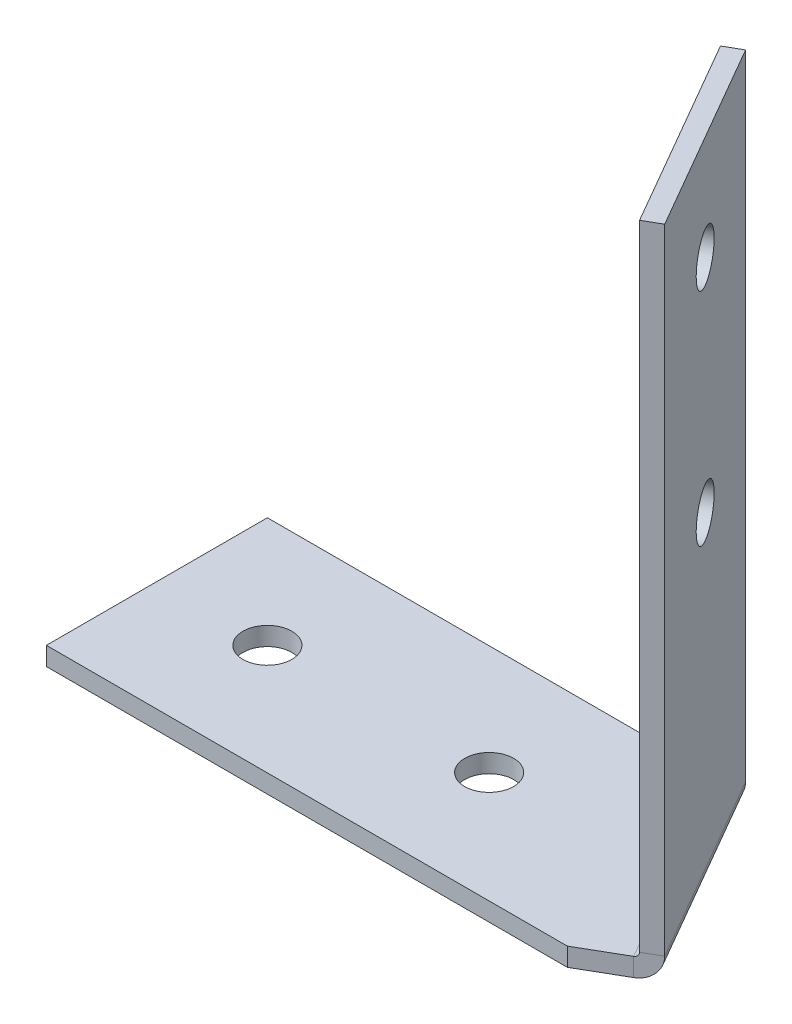
ISO-10303-21;
HEADER;
FILE_DESCRIPTION(('STEP AP214'),'2;1');
FILE_NAME('part.step','',(''),(''),'','','');
FILE_SCHEMA(('AUTOMOTIVE_DESIGN { 1 0 10303 214 1 1 1 1 }'));
ENDSEC;
DATA;
#1=APPLICATION_CONTEXT('core data for automotive mechanical design processes');
#2=APPLICATION_PROTOCOL_DEFINITION('international standard','automotive_design',2000,#1);
#3=PRODUCT_CONTEXT('',#1,'mechanical');
#4=PRODUCT('Part','Part','',(#3));
#5=PRODUCT_RELATED_PRODUCT_CATEGORY('part','',(#4));
#6=PRODUCT_DEFINITION_FORMATION('','',#4);
#7=PRODUCT_DEFINITION_CONTEXT('part definition',#1,'design');
#8=PRODUCT_DEFINITION('design','',#6,#7);
#9=PRODUCT_DEFINITION_SHAPE('','',#8);
#10=(LENGTH_UNIT() NAMED_UNIT(*) SI_UNIT(.MILLI.,.METRE.));
#11=(NAMED_UNIT(*) PLANE_ANGLE_UNIT() SI_UNIT($,.RADIAN.));
#12=(NAMED_UNIT(*) SI_UNIT($,.STERADIAN.) SOLID_ANGLE_UNIT());
#13=UNCERTAINTY_MEASURE_WITH_UNIT(LENGTH_MEASURE(1.E-05),#10,'distance_accuracy_value','');
#14=(GEOMETRIC_REPRESENTATION_CONTEXT(3) GLOBAL_UNCERTAINTY_ASSIGNED_CONTEXT((#13)) GLOBAL_UNIT_ASSIGNED_CONTEXT((#10,
#11,#12)) REPRESENTATION_CONTEXT('',''));
#15=CARTESIAN_POINT('',(0.,0.,0.));
#16=DIRECTION('',(0.,0.,1.));
#17=DIRECTION('',(1.,0.,0.));
#18=AXIS2_PLACEMENT_3D('',#15,#16,#17);
#19=CARTESIAN_POINT('',(78.0067508060374,-89.0769248960511,-45.0372185764735));
#20=DIRECTION('',(-0.86602540378444,0.,0.499999999999998));
#21=DIRECTION('',(0.43301270189222,-0.499999999999998,0.750000000000001));
#22=AXIS2_PLACEMENT_3D('',#19,#20,#21);
#23=PLANE('',#22);
#24=CARTESIAN_POINT('',(90.9347055499118,92.0750000000004,-22.6453441221305));
#25=DIRECTION('',(-0.86602540378444,0.,0.499999999999998));
#26=DIRECTION('',(0.499999999999998,0.,0.86602540378444));
#27=AXIS2_PLACEMENT_3D('',#24,#25,#26);
#28=CIRCLE('',#27,4.21639999999999);
#29=CARTESIAN_POINT('',(93.0429055499118,92.0750000000004,-18.9938346096138));
#30=VERTEX_POINT('',#29);
#31=EDGE_CURVE('E433',#30,#30,#28,.T.);
#32=ORIENTED_EDGE('',*,*,#31,.T.);
#33=EDGE_LOOP('',(#32));
#34=FACE_BOUND('',#33,.T.);
#35=CARTESIAN_POINT('',(90.934705549912,53.9750000000004,-22.6453441221305));
#36=DIRECTION('',(-0.86602540378444,0.,0.499999999999998));
#37=DIRECTION('',(0.499999999999998,0.,0.86602540378444));
#38=AXIS2_PLACEMENT_3D('',#35,#36,#37);
#39=CIRCLE('',#38,4.21639999999999);
#40=CARTESIAN_POINT('',(93.042905549912,53.9750000000004,-18.9938346096138));
#41=VERTEX_POINT('',#40);
#42=EDGE_CURVE('E429',#41,#41,#39,.T.);
#43=ORIENTED_EDGE('',*,*,#42,.T.);
#44=EDGE_LOOP('',(#43));
#45=FACE_BOUND('',#44,.T.);
#46=DIRECTION('',(0.,1.,0.));
#47=VECTOR('',#46,1.);
#48=CARTESIAN_POINT('',(100.459705549912,-11.2976081031777,-6.14756018003684));
#49=LINE('',#48,#47);
#50=CARTESIAN_POINT('',(100.459705549912,0.736600000000018,-6.14756018003682));
#51=VERTEX_POINT('',#50);
#52=CARTESIAN_POINT('',(100.459705549912,110.036256128448,-6.14756018003666));
#53=VERTEX_POINT('',#52);
#54=EDGE_CURVE('E59',#51,#53,#49,.T.);
#55=ORIENTED_EDGE('',*,*,#54,.F.);
#56=DIRECTION('',(-0.499999999999998,0.,-0.86602540378444));
#57=VECTOR('',#56,1.);
#58=CARTESIAN_POINT('',(78.0067508060371,0.73659999999999,-45.0372185764734));
#59=LINE('',#58,#57);
#60=CARTESIAN_POINT('',(81.4097055499123,0.736600000000027,-39.143128064224));
#61=VERTEX_POINT('',#60);
#62=EDGE_CURVE('E161',#51,#61,#59,.T.);
#63=ORIENTED_EDGE('',*,*,#62,.T.);
#64=DIRECTION('',(0.,-1.,0.));
#65=VECTOR('',#64,1.);
#66=CARTESIAN_POINT('',(81.4097055499119,110.036256128448,-39.1431280642239));
#67=LINE('',#66,#65);
#68=CARTESIAN_POINT('',(81.4097055499119,110.036256128448,-39.1431280642239));
#69=VERTEX_POINT('',#68);
#70=EDGE_CURVE('E378',#69,#61,#67,.T.);
#71=ORIENTED_EDGE('',*,*,#70,.F.);
#72=DIRECTION('',(-0.499999999999998,0.,-0.86602540378444));
#73=VECTOR('',#72,1.);
#74=CARTESIAN_POINT('',(100.459705549912,110.036256128448,-6.14756018003666));
#75=LINE('',#74,#73);
#76=EDGE_CURVE('E375',#53,#69,#75,.T.);
#77=ORIENTED_EDGE('',*,*,#76,.F.);
#78=EDGE_LOOP('',(#55,#63,#71,#77));
#79=FACE_BOUND('',#78,.T.);
#80=ADVANCED_FACE('F55',(#34,#45,#79),#23,.F.);
#81=CARTESIAN_POINT('',(81.4097055499119,110.036256128448,-39.1431280642239));
#82=DIRECTION('',(-0.499999999999998,0.,-0.86602540378444));
#83=DIRECTION('',(0.,-1.,0.));
#84=AXIS2_PLACEMENT_3D('',#81,#82,#83);
#85=PLANE('',#84);
#86=DIRECTION('',(0.86602540378444,0.,-0.499999999999998));
#87=VECTOR('',#86,1.);
#88=CARTESIAN_POINT('',(81.4097055499123,0.73659999999999,-39.143128064224));
#89=LINE('',#88,#87);
#90=CARTESIAN_POINT('',(78.6600748928967,0.736600000000004,-37.555628064224));
#91=VERTEX_POINT('',#90);
#92=EDGE_CURVE('E12',#91,#61,#89,.T.);
#93=ORIENTED_EDGE('',*,*,#92,.F.);
#94=DIRECTION('',(0.,-1.,0.));
#95=VECTOR('',#94,1.);
#96=CARTESIAN_POINT('',(78.6600748928963,110.036256128448,-37.5556280642239));
#97=LINE('',#96,#95);
#98=CARTESIAN_POINT('',(78.6600748928963,110.036256128448,-37.5556280642239));
#99=VERTEX_POINT('',#98);
#100=EDGE_CURVE('E72',#99,#91,#97,.T.);
#101=ORIENTED_EDGE('',*,*,#100,.F.);
#102=DIRECTION('',(-0.86602540378444,0.,0.499999999999998));
#103=VECTOR('',#102,1.);
#104=CARTESIAN_POINT('',(81.4097055499119,110.036256128448,-39.1431280642239));
#105=LINE('',#104,#103);
#106=EDGE_CURVE('E381',#69,#99,#105,.T.);
#107=ORIENTED_EDGE('',*,*,#106,.F.);
#108=ORIENTED_EDGE('',*,*,#70,.T.);
#109=EDGE_LOOP('',(#93,#101,#107,#108));
#110=FACE_BOUND('',#109,.T.);
#111=ADVANCED_FACE('F57',(#110),#85,.T.);
#112=CARTESIAN_POINT('',(100.459705549912,110.036256128448,-6.14756018003666));
#113=DIRECTION('',(0.,1.,0.));
#114=DIRECTION('',(-0.499999999999998,0.,-0.86602540378444));
#115=AXIS2_PLACEMENT_3D('',#112,#113,#114);
#116=PLANE('',#115);
#117=DIRECTION('',(-0.499999999999998,0.,-0.86602540378444));
#118=VECTOR('',#117,1.);
#119=CARTESIAN_POINT('',(97.7100748928963,110.036256128448,-4.56006018003667));
#120=LINE('',#119,#118);
#121=CARTESIAN_POINT('',(97.7100748928963,110.036256128448,-4.56006018003667));
#122=VERTEX_POINT('',#121);
#123=EDGE_CURVE('E379',#122,#99,#120,.T.);
#124=ORIENTED_EDGE('',*,*,#123,.F.);
#125=DIRECTION('',(-0.86602540378444,0.,0.499999999999998));
#126=VECTOR('',#125,1.);
#127=CARTESIAN_POINT('',(100.459705549912,110.036256128448,-6.14756018003666));
#128=LINE('',#127,#126);
#129=EDGE_CURVE('E383',#53,#122,#128,.T.);
#130=ORIENTED_EDGE('',*,*,#129,.F.);
#131=ORIENTED_EDGE('',*,*,#76,.T.);
#132=ORIENTED_EDGE('',*,*,#106,.T.);
#133=EDGE_LOOP('',(#124,#130,#131,#132));
#134=FACE_BOUND('',#133,.T.);
#135=ADVANCED_FACE('F219',(#134),#116,.T.);
#136=CARTESIAN_POINT('',(100.459705549912,-11.2976081031777,-6.14756018003684));
#137=DIRECTION('',(0.499999999999998,0.,0.86602540378444));
#138=DIRECTION('',(0.,1.,0.));
#139=AXIS2_PLACEMENT_3D('',#136,#137,#138);
#140=PLANE('',#139);
#141=DIRECTION('',(-0.86602540378444,0.,0.499999999999998));
#142=VECTOR('',#141,1.);
#143=CARTESIAN_POINT('',(100.459705549912,0.736600000000018,-6.14756018003682));
#144=LINE('',#143,#142);
#145=CARTESIAN_POINT('',(97.7100748928966,0.736600000000004,-4.56006018003682));
#146=VERTEX_POINT('',#145);
#147=EDGE_CURVE('E248',#51,#146,#144,.T.);
#148=ORIENTED_EDGE('',*,*,#147,.F.);
#149=ORIENTED_EDGE('',*,*,#54,.T.);
#150=ORIENTED_EDGE('',*,*,#129,.T.);
#151=DIRECTION('',(0.,1.,0.));
#152=VECTOR('',#151,1.);
#153=CARTESIAN_POINT('',(97.7100748928967,-11.2976081031777,-4.56006018003684));
#154=LINE('',#153,#152);
#155=EDGE_CURVE('E80',#146,#122,#154,.T.);
#156=ORIENTED_EDGE('',*,*,#155,.F.);
#157=EDGE_LOOP('',(#148,#149,#150,#156));
#158=FACE_BOUND('',#157,.T.);
#159=ADVANCED_FACE('F222',(#158),#140,.T.);
#160=CARTESIAN_POINT('',(75.2571201490218,-89.0769248960511,-43.4497185764735));
#161=DIRECTION('',(-0.86602540378444,0.,0.499999999999998));
#162=DIRECTION('',(0.43301270189222,-0.499999999999998,0.750000000000001));
#163=AXIS2_PLACEMENT_3D('',#160,#161,#162);
#164=PLANE('',#163);
#165=CARTESIAN_POINT('',(88.1850748928963,92.0750000000004,-21.0578441221305));
#166=DIRECTION('',(-0.866025403784439,0.,0.499999999999998));
#167=DIRECTION('',(0.499999999999999,0.,0.86602540378444));
#168=AXIS2_PLACEMENT_3D('',#165,#166,#167);
#169=CIRCLE('',#168,4.21639999999999);
#170=CARTESIAN_POINT('',(90.2932748928963,92.0750000000004,-17.4063346096138));
#171=VERTEX_POINT('',#170);
#172=EDGE_CURVE('E241',#171,#171,#169,.T.);
#173=ORIENTED_EDGE('',*,*,#172,.F.);
#174=EDGE_LOOP('',(#173));
#175=FACE_BOUND('',#174,.T.);
#176=CARTESIAN_POINT('',(88.1850748928965,53.9750000000004,-21.0578441221305));
#177=DIRECTION('',(-0.866025403784439,0.,0.499999999999998));
#178=DIRECTION('',(0.499999999999999,0.,0.86602540378444));
#179=AXIS2_PLACEMENT_3D('',#176,#177,#178);
#180=CIRCLE('',#179,4.21639999999999);
#181=CARTESIAN_POINT('',(90.2932748928964,53.9750000000004,-17.4063346096138));
#182=VERTEX_POINT('',#181);
#183=EDGE_CURVE('E244',#182,#182,#180,.T.);
#184=ORIENTED_EDGE('',*,*,#183,.F.);
#185=EDGE_LOOP('',(#184));
#186=FACE_BOUND('',#185,.T.);
#187=DIRECTION('',(-0.499999999999998,0.,-0.86602540378444));
#188=VECTOR('',#187,1.);
#189=CARTESIAN_POINT('',(75.2571201490215,0.736599999999976,-43.4497185764734));
#190=LINE('',#189,#188);
#191=EDGE_CURVE('E64',#146,#91,#190,.T.);
#192=ORIENTED_EDGE('',*,*,#191,.F.);
#193=ORIENTED_EDGE('',*,*,#155,.T.);
#194=ORIENTED_EDGE('',*,*,#123,.T.);
#195=ORIENTED_EDGE('',*,*,#100,.T.);
#196=EDGE_LOOP('',(#192,#193,#194,#195));
#197=FACE_BOUND('',#196,.T.);
#198=ADVANCED_FACE('F228',(#175,#186,#197),#164,.T.);
#199=CARTESIAN_POINT('',(0.,-3.175,0.));
#200=DIRECTION('',(-1.,0.,0.));
#201=DIRECTION('',(0.,0.,1.));
#202=AXIS2_PLACEMENT_3D('',#199,#200,#201);
#203=PLANE('',#202);
#204=DIRECTION('',(0.,0.,1.));
#205=VECTOR('',#204,1.);
#206=CARTESIAN_POINT('',(0.,0.,0.));
#207=LINE('',#206,#205);
#208=CARTESIAN_POINT('',(0.,0.,-38.1));
#209=VERTEX_POINT('',#208);
#210=CARTESIAN_POINT('',(0.,0.,0.));
#211=VERTEX_POINT('',#210);
#212=EDGE_CURVE('E365',#209,#211,#207,.T.);
#213=ORIENTED_EDGE('',*,*,#212,.F.);
#214=DIRECTION('',(0.,1.,0.));
#215=VECTOR('',#214,1.);
#216=CARTESIAN_POINT('',(0.,-3.175,-38.1));
#217=LINE('',#216,#215);
#218=CARTESIAN_POINT('',(0.,-3.175,-38.1));
#219=VERTEX_POINT('',#218);
#220=EDGE_CURVE('E194',#219,#209,#217,.T.);
#221=ORIENTED_EDGE('',*,*,#220,.F.);
#222=DIRECTION('',(0.,0.,1.));
#223=VECTOR('',#222,1.);
#224=CARTESIAN_POINT('',(0.,-3.175,0.));
#225=LINE('',#224,#223);
#226=CARTESIAN_POINT('',(0.,-3.175,0.));
#227=VERTEX_POINT('',#226);
#228=EDGE_CURVE('E175',#219,#227,#225,.T.);
#229=ORIENTED_EDGE('',*,*,#228,.T.);
#230=DIRECTION('',(0.,1.,0.));
#231=VECTOR('',#230,1.);
#232=CARTESIAN_POINT('',(0.,-3.175,0.));
#233=LINE('',#232,#231);
#234=EDGE_CURVE('E186',#227,#211,#233,.T.);
#235=ORIENTED_EDGE('',*,*,#234,.T.);
#236=EDGE_LOOP('',(#213,#221,#229,#235));
#237=FACE_BOUND('',#236,.T.);
#238=ADVANCED_FACE('F230',(#237),#203,.T.);
#239=CARTESIAN_POINT('',(0.,-3.175,0.));
#240=DIRECTION('',(0.,0.,1.));
#241=DIRECTION('',(1.,0.,0.));
#242=AXIS2_PLACEMENT_3D('',#239,#240,#241);
#243=PLANE('',#242);
#244=DIRECTION('',(1.,0.,0.));
#245=VECTOR('',#244,1.);
#246=CARTESIAN_POINT('',(0.,0.,0.));
#247=LINE('',#246,#245);
#248=CARTESIAN_POINT('',(89.8118189755011,0.,0.));
#249=VERTEX_POINT('',#248);
#250=EDGE_CURVE('E362',#211,#249,#247,.T.);
#251=ORIENTED_EDGE('',*,*,#250,.F.);
#252=ORIENTED_EDGE('',*,*,#234,.F.);
#253=DIRECTION('',(1.,0.,0.));
#254=VECTOR('',#253,1.);
#255=CARTESIAN_POINT('',(0.,-3.175,0.));
#256=LINE('',#255,#254);
#257=CARTESIAN_POINT('',(89.8118189755011,-3.175,0.));
#258=VERTEX_POINT('',#257);
#259=EDGE_CURVE('E181',#227,#258,#256,.T.);
#260=ORIENTED_EDGE('',*,*,#259,.T.);
#261=DIRECTION('',(0.,1.,0.));
#262=VECTOR('',#261,1.);
#263=CARTESIAN_POINT('',(89.8118189755011,-3.175,0.));
#264=LINE('',#263,#262);
#265=EDGE_CURVE('E179',#258,#249,#264,.T.);
#266=ORIENTED_EDGE('',*,*,#265,.T.);
#267=EDGE_LOOP('',(#251,#252,#260,#266));
#268=FACE_BOUND('',#267,.T.);
#269=ADVANCED_FACE('F235',(#268),#243,.T.);
#270=CARTESIAN_POINT('',(0.,-3.175,0.));
#271=DIRECTION('',(0.,1.,0.));
#272=DIRECTION('',(0.,0.,1.));
#273=AXIS2_PLACEMENT_3D('',#270,#271,#272);
#274=PLANE('',#273);
#275=CARTESIAN_POINT('',(19.05,-3.175,-19.05));
#276=DIRECTION('',(0.,1.,0.));
#277=DIRECTION('',(0.,0.,1.));
#278=AXIS2_PLACEMENT_3D('',#275,#276,#277);
#279=CIRCLE('',#278,4.2164);
#280=CARTESIAN_POINT('',(19.05,-3.175,-14.8336));
#281=VERTEX_POINT('',#280);
#282=EDGE_CURVE('E423',#281,#281,#279,.T.);
#283=ORIENTED_EDGE('',*,*,#282,.T.);
#284=EDGE_LOOP('',(#283));
#285=FACE_BOUND('',#284,.T.);
#286=CARTESIAN_POINT('',(57.15,-3.175,-19.1887568699662));
#287=DIRECTION('',(0.,1.,0.));
#288=DIRECTION('',(0.,0.,1.));
#289=AXIS2_PLACEMENT_3D('',#286,#287,#288);
#290=CIRCLE('',#289,4.2164);
#291=CARTESIAN_POINT('',(57.15,-3.175,-14.9723568699662));
#292=VERTEX_POINT('',#291);
#293=EDGE_CURVE('E257',#292,#292,#290,.T.);
#294=ORIENTED_EDGE('',*,*,#293,.T.);
#295=EDGE_LOOP('',(#294));
#296=FACE_BOUND('',#295,.T.);
#297=DIRECTION('',(-0.499999999999998,0.,-0.86602540378444));
#298=VECTOR('',#297,1.);
#299=CARTESIAN_POINT('',(74.6192058365939,-3.175,-43.0814185764733));
#300=LINE('',#299,#298);
#301=CARTESIAN_POINT('',(97.072160580469,-3.175,-4.19176018003681));
#302=VERTEX_POINT('',#301);
#303=CARTESIAN_POINT('',(77.495229192667,-3.175,-38.1));
#304=VERTEX_POINT('',#303);
#305=EDGE_CURVE('E158',#302,#304,#300,.T.);
#306=ORIENTED_EDGE('',*,*,#305,.F.);
#307=DIRECTION('',(0.86602540378444,0.,-0.499999999999998));
#308=VECTOR('',#307,1.);
#309=CARTESIAN_POINT('',(89.8118189755011,-3.175,0.));
#310=LINE('',#309,#308);
#311=EDGE_CURVE('E151',#258,#302,#310,.T.);
#312=ORIENTED_EDGE('',*,*,#311,.F.);
#313=ORIENTED_EDGE('',*,*,#259,.F.);
#314=ORIENTED_EDGE('',*,*,#228,.F.);
#315=DIRECTION('',(-1.,0.,0.));
#316=VECTOR('',#315,1.);
#317=CARTESIAN_POINT('',(79.6029547438754,-3.175,-38.1));
#318=LINE('',#317,#316);
#319=EDGE_CURVE('E172',#304,#219,#318,.T.);
#320=ORIENTED_EDGE('',*,*,#319,.F.);
#321=EDGE_LOOP('',(#306,#312,#313,#314,#320));
#322=FACE_BOUND('',#321,.T.);
#323=ADVANCED_FACE('F168',(#285,#296,#322),#274,.F.);
#324=CARTESIAN_POINT('',(89.8118189755011,-3.175,0.));
#325=DIRECTION('',(0.499999999999998,0.,0.86602540378444));
#326=DIRECTION('',(0.86602540378444,0.,-0.499999999999998));
#327=AXIS2_PLACEMENT_3D('',#324,#325,#326);
#328=PLANE('',#327);
#329=ORIENTED_EDGE('',*,*,#311,.T.);
#330=DIRECTION('',(0.,1.,0.));
#331=VECTOR('',#330,1.);
#332=CARTESIAN_POINT('',(97.072160580469,-3.175,-4.19176018003682));
#333=LINE('',#332,#331);
#334=CARTESIAN_POINT('',(97.072160580469,0.,-4.19176018003682));
#335=VERTEX_POINT('',#334);
#336=EDGE_CURVE('E138',#302,#335,#333,.T.);
#337=ORIENTED_EDGE('',*,*,#336,.T.);
#338=DIRECTION('',(0.86602540378444,0.,-0.499999999999998));
#339=VECTOR('',#338,1.);
#340=CARTESIAN_POINT('',(89.8118189755011,0.,0.));
#341=LINE('',#340,#339);
#342=EDGE_CURVE('E150',#249,#335,#341,.T.);
#343=ORIENTED_EDGE('',*,*,#342,.F.);
#344=ORIENTED_EDGE('',*,*,#265,.F.);
#345=EDGE_LOOP('',(#329,#337,#343,#344));
#346=FACE_BOUND('',#345,.T.);
#347=ADVANCED_FACE('F178',(#346),#328,.T.);
#348=CARTESIAN_POINT('',(0.,0.,0.));
#349=DIRECTION('',(0.,1.,0.));
#350=DIRECTION('',(0.,0.,1.));
#351=AXIS2_PLACEMENT_3D('',#348,#349,#350);
#352=PLANE('',#351);
#353=CARTESIAN_POINT('',(19.05,0.,-19.05));
#354=DIRECTION('',(0.,1.,0.));
#355=DIRECTION('',(0.,0.,1.));
#356=AXIS2_PLACEMENT_3D('',#353,#354,#355);
#357=CIRCLE('',#356,4.2164);
#358=CARTESIAN_POINT('',(19.05,0.,-14.8336));
#359=VERTEX_POINT('',#358);
#360=EDGE_CURVE('E419',#359,#359,#357,.T.);
#361=ORIENTED_EDGE('',*,*,#360,.F.);
#362=EDGE_LOOP('',(#361));
#363=FACE_BOUND('',#362,.T.);
#364=CARTESIAN_POINT('',(57.15,0.,-19.1887568699662));
#365=DIRECTION('',(0.,1.,0.));
#366=DIRECTION('',(0.,0.,1.));
#367=AXIS2_PLACEMENT_3D('',#364,#365,#366);
#368=CIRCLE('',#367,4.2164);
#369=CARTESIAN_POINT('',(57.15,0.,-14.9723568699662));
#370=VERTEX_POINT('',#369);
#371=EDGE_CURVE('E262',#370,#370,#368,.T.);
#372=ORIENTED_EDGE('',*,*,#371,.F.);
#373=EDGE_LOOP('',(#372));
#374=FACE_BOUND('',#373,.T.);
#375=ORIENTED_EDGE('',*,*,#342,.T.);
#376=DIRECTION('',(-0.499999999999998,0.,-0.86602540378444));
#377=VECTOR('',#376,1.);
#378=CARTESIAN_POINT('',(74.6192058365939,0.,-43.0814185764733));
#379=LINE('',#378,#377);
#380=CARTESIAN_POINT('',(77.495229192667,0.,-38.1));
#381=VERTEX_POINT('',#380);
#382=EDGE_CURVE('E254',#335,#381,#379,.T.);
#383=ORIENTED_EDGE('',*,*,#382,.T.);
#384=DIRECTION('',(-1.,0.,0.));
#385=VECTOR('',#384,1.);
#386=CARTESIAN_POINT('',(79.6029547438754,0.,-38.1));
#387=LINE('',#386,#385);
#388=EDGE_CURVE('E205',#381,#209,#387,.T.);
#389=ORIENTED_EDGE('',*,*,#388,.T.);
#390=ORIENTED_EDGE('',*,*,#212,.T.);
#391=ORIENTED_EDGE('',*,*,#250,.T.);
#392=EDGE_LOOP('',(#375,#383,#389,#390,#391));
#393=FACE_BOUND('',#392,.T.);
#394=ADVANCED_FACE('F217',(#363,#374,#393),#352,.T.);
#395=CARTESIAN_POINT('',(79.6029547438754,-3.175,-38.1));
#396=DIRECTION('',(0.,0.,-1.));
#397=DIRECTION('',(-1.,0.,0.));
#398=AXIS2_PLACEMENT_3D('',#395,#396,#397);
#399=PLANE('',#398);
#400=ORIENTED_EDGE('',*,*,#388,.F.);
#401=CARTESIAN_POINT('',(77.495229192667,-3.175,-38.1));
#402=CARTESIAN_POINT('',(77.495229192667,0.,-38.1));
#403=B_SPLINE_CURVE_WITH_KNOTS('',1,(#401,#402),.UNSPECIFIED.,.F.,.F.,(2,2),(0.,1.),.UNSPECIFIED.);
#404=EDGE_CURVE('E195',#381,#304,#403,.F.);
#405=ORIENTED_EDGE('',*,*,#404,.T.);
#406=ORIENTED_EDGE('',*,*,#319,.T.);
#407=ORIENTED_EDGE('',*,*,#220,.T.);
#408=EDGE_LOOP('',(#400,#405,#406,#407));
#409=FACE_BOUND('',#408,.T.);
#410=ADVANCED_FACE('F207',(#409),#399,.T.);
#411=CARTESIAN_POINT('',(97.072160580469,0.7366,-4.19176018003681));
#412=DIRECTION('',(0.499999999999998,0.,0.86602540378444));
#413=DIRECTION('',(0.86602540378444,0.,-0.499999999999998));
#414=AXIS2_PLACEMENT_3D('',#411,#412,#413);
#415=PLANE('',#414);
#416=ORIENTED_EDGE('',*,*,#147,.T.);
#417=CARTESIAN_POINT('',(97.072160580469,0.7366,-4.1917601800368));
#418=DIRECTION('',(0.499999999999998,0.,0.86602540378444));
#419=DIRECTION('',(0.86602540378444,0.,-0.499999999999998));
#420=AXIS2_PLACEMENT_3D('',#417,#418,#419);
#421=CIRCLE('',#420,0.7366);
#422=EDGE_CURVE('E145',#146,#335,#421,.F.);
#423=ORIENTED_EDGE('',*,*,#422,.T.);
#424=ORIENTED_EDGE('',*,*,#336,.F.);
#425=CARTESIAN_POINT('',(97.072160580469,0.7366,-4.19176018003681));
#426=DIRECTION('',(-0.499999999999998,0.,-0.86602540378444));
#427=DIRECTION('',(0.86602540378444,0.,-0.499999999999998));
#428=AXIS2_PLACEMENT_3D('',#425,#426,#427);
#429=CIRCLE('',#428,3.9116);
#430=EDGE_CURVE('E142',#51,#302,#429,.T.);
#431=ORIENTED_EDGE('',*,*,#430,.F.);
#432=EDGE_LOOP('',(#416,#423,#424,#431));
#433=FACE_BOUND('',#432,.T.);
#434=ADVANCED_FACE('F141',(#433),#415,.T.);
#435=CARTESIAN_POINT('',(77.495229192667,-3.175,-38.1));
#436=CARTESIAN_POINT('',(78.0265653887558,-3.17499999999999,-38.2039183929004));
#437=CARTESIAN_POINT('',(78.5575557175247,-3.07319152205578,-38.3077025336379));
#438=CARTESIAN_POINT('',(79.5525487280066,-2.68130283668651,-38.4765300446254));
#439=CARTESIAN_POINT('',(80.0160785848054,-2.3914352260165,-38.5413658637113));
#440=CARTESIAN_POINT('',(80.4175165999367,-2.02931888528931,-38.5702875068686));
#441=CARTESIAN_POINT('',(77.495229192667,0.,-38.1));
#442=CARTESIAN_POINT('',(77.6665610318804,0.,-37.9960940299468));
#443=CARTESIAN_POINT('',(77.8378457102814,0.0191717263661183,-37.8921777672175));
#444=CARTESIAN_POINT('',(78.1677825401238,0.0929689463382524,-37.6770349132866));
#445=CARTESIAN_POINT('',(78.3263606989405,0.147562557301824,-37.5657825380547));
#446=CARTESIAN_POINT('',(78.4732341166026,0.215745144977989,-37.447755491735));
#447=B_SPLINE_SURFACE_WITH_KNOTS('',1,3,((#435,#436,#437,#438,#439,#440),(#441,#442,#443,#444,
#445,#446)),.UNSPECIFIED.,.F.,.F.,.F.,(2,2),(4,2,4),(0.,1.),(0.,0.5,1.),.UNSPECIFIED.);
#448=CARTESIAN_POINT('',(77.495229192667,0.,-38.1));
#449=CARTESIAN_POINT('',(77.6665610318804,0.,-37.9960940299468));
#450=CARTESIAN_POINT('',(77.8378457102814,0.0191717263661183,-37.8921777672175));
#451=CARTESIAN_POINT('',(78.1677825401238,0.0929689463382524,-37.6770349132866));
#452=CARTESIAN_POINT('',(78.3263606989405,0.147562557301824,-37.5657825380547));
#453=CARTESIAN_POINT('',(78.4732341166026,0.215745144977989,-37.447755491735));
#454=B_SPLINE_CURVE_WITH_KNOTS('',3,(#448,#449,#450,#451,#452,#453),.UNSPECIFIED.,.F.,.F.,(4,2,
4),(0.,0.5,1.),.UNSPECIFIED.);
#455=CARTESIAN_POINT('',(78.4732341166026,0.215745144977987,-37.447755491735));
#456=VERTEX_POINT('',#455);
#457=EDGE_CURVE('E256',#381,#456,#454,.T.);
#458=CARTESIAN_POINT('',(78.4732341166026,0.215745144977989,-37.447755491735));
#459=CARTESIAN_POINT('',(80.4175165999367,-2.02931888528931,-38.5702875068686));
#460=B_SPLINE_CURVE_WITH_KNOTS('',1,(#458,#459),.UNSPECIFIED.,.F.,.F.,(2,2),(0.,1.),.UNSPECIFIED.);
#461=CARTESIAN_POINT('',(80.4175165999367,-2.02931888528931,-38.5702875068686));
#462=VERTEX_POINT('',#461);
#463=EDGE_CURVE('E176',#456,#462,#460,.T.);
#464=CARTESIAN_POINT('',(80.4175165999367,-2.02931888528931,-38.5702875068686));
#465=CARTESIAN_POINT('',(80.0160785848054,-2.3914352260165,-38.5413658637113));
#466=CARTESIAN_POINT('',(79.5525487280066,-2.68130283668651,-38.4765300446254));
#467=CARTESIAN_POINT('',(78.5575557175247,-3.07319152205578,-38.3077025336379));
#468=CARTESIAN_POINT('',(78.0265653887558,-3.17499999999999,-38.2039183929004));
#469=CARTESIAN_POINT('',(77.495229192667,-3.175,-38.1));
#470=B_SPLINE_CURVE_WITH_KNOTS('',3,(#464,#465,#466,#467,#468,#469),.UNSPECIFIED.,.F.,.F.,(4,2,
4),(0.,0.5,1.),.UNSPECIFIED.);
#471=EDGE_CURVE('E162',#304,#462,#470,.F.);
#472=ORIENTED_EDGE('',*,*,#404,.F.);
#473=ORIENTED_EDGE('',*,*,#457,.T.);
#474=ORIENTED_EDGE('',*,*,#463,.T.);
#475=ORIENTED_EDGE('',*,*,#471,.F.);
#476=EDGE_LOOP('',(#472,#473,#474,#475));
#477=FACE_BOUND('',#476,.T.);
#478=ADVANCED_FACE('F309',(#477),#447,.T.);
#479=CARTESIAN_POINT('',(78.022160580469,0.7366,-37.187328064224));
#480=DIRECTION('',(-0.499999999999996,0.,-0.866025403784441));
#481=DIRECTION('',(-0.866025403784441,0.,0.499999999999996));
#482=AXIS2_PLACEMENT_3D('',#479,#480,#481);
#483=PLANE('',#482);
#484=ORIENTED_EDGE('',*,*,#463,.F.);
#485=CARTESIAN_POINT('',(78.0221605804691,0.7366,-37.187328064224));
#486=DIRECTION('',(0.499999999999998,0.,0.86602540378444));
#487=DIRECTION('',(0.86602540378444,0.,-0.499999999999998));
#488=AXIS2_PLACEMENT_3D('',#485,#486,#487);
#489=CIRCLE('',#488,0.7366);
#490=EDGE_CURVE('E163',#456,#91,#489,.T.);
#491=ORIENTED_EDGE('',*,*,#490,.T.);
#492=ORIENTED_EDGE('',*,*,#92,.T.);
#493=CARTESIAN_POINT('',(78.022160580469,0.7366,-37.187328064224));
#494=DIRECTION('',(0.499999999999996,0.,0.866025403784441));
#495=DIRECTION('',(-0.866025403784441,0.,0.499999999999996));
#496=AXIS2_PLACEMENT_3D('',#493,#494,#495);
#497=CIRCLE('',#496,3.91159999999999);
#498=EDGE_CURVE('E273',#462,#61,#497,.T.);
#499=ORIENTED_EDGE('',*,*,#498,.F.);
#500=EDGE_LOOP('',(#484,#491,#492,#499));
#501=FACE_BOUND('',#500,.T.);
#502=ADVANCED_FACE('F285',(#501),#483,.T.);
#503=CARTESIAN_POINT('',(66.429338031747,0.7366,-57.2666857217409));
#504=DIRECTION('',(0.499999999999998,0.,0.86602540378444));
#505=DIRECTION('',(0.86602540378444,0.,-0.499999999999998));
#506=AXIS2_PLACEMENT_3D('',#503,#504,#505);
#507=CYLINDRICAL_SURFACE('',#506,3.9116);
#508=ORIENTED_EDGE('',*,*,#498,.T.);
#509=ORIENTED_EDGE('',*,*,#62,.F.);
#510=ORIENTED_EDGE('',*,*,#430,.T.);
#511=ORIENTED_EDGE('',*,*,#305,.T.);
#512=ORIENTED_EDGE('',*,*,#471,.T.);
#513=EDGE_LOOP('',(#508,#509,#510,#511,#512));
#514=FACE_BOUND('',#513,.T.);
#515=ADVANCED_FACE('F156',(#514),#507,.T.);
#516=CARTESIAN_POINT('',(66.429338031747,0.7366,-57.2666857217409));
#517=DIRECTION('',(0.499999999999998,0.,0.86602540378444));
#518=DIRECTION('',(0.86602540378444,0.,-0.499999999999998));
#519=AXIS2_PLACEMENT_3D('',#516,#517,#518);
#520=CYLINDRICAL_SURFACE('',#519,0.7366);
#521=ORIENTED_EDGE('',*,*,#490,.F.);
#522=ORIENTED_EDGE('',*,*,#457,.F.);
#523=ORIENTED_EDGE('',*,*,#382,.F.);
#524=ORIENTED_EDGE('',*,*,#422,.F.);
#525=ORIENTED_EDGE('',*,*,#191,.T.);
#526=EDGE_LOOP('',(#521,#522,#523,#524,#525));
#527=FACE_BOUND('',#526,.T.);
#528=ADVANCED_FACE('F251',(#527),#520,.F.);
#529=CARTESIAN_POINT('',(57.15,0.,-19.1887568699662));
#530=DIRECTION('',(0.,1.,0.));
#531=DIRECTION('',(0.,0.,1.));
#532=AXIS2_PLACEMENT_3D('',#529,#530,#531);
#533=CYLINDRICAL_SURFACE('',#532,4.2164);
#534=ORIENTED_EDGE('',*,*,#293,.F.);
#535=EDGE_LOOP('',(#534));
#536=FACE_BOUND('',#535,.T.);
#537=ORIENTED_EDGE('',*,*,#371,.T.);
#538=EDGE_LOOP('',(#537));
#539=FACE_BOUND('',#538,.T.);
#540=ADVANCED_FACE('F286',(#536,#539),#533,.F.);
#541=CARTESIAN_POINT('',(19.05,0.,-19.05));
#542=DIRECTION('',(0.,1.,0.));
#543=DIRECTION('',(0.,0.,1.));
#544=AXIS2_PLACEMENT_3D('',#541,#542,#543);
#545=CYLINDRICAL_SURFACE('',#544,4.2164);
#546=ORIENTED_EDGE('',*,*,#282,.F.);
#547=EDGE_LOOP('',(#546));
#548=FACE_BOUND('',#547,.T.);
#549=ORIENTED_EDGE('',*,*,#360,.T.);
#550=EDGE_LOOP('',(#549));
#551=FACE_BOUND('',#550,.T.);
#552=ADVANCED_FACE('F445',(#548,#551),#545,.F.);
#553=CARTESIAN_POINT('',(88.1850748928965,53.9750000000004,-21.0578441221305));
#554=DIRECTION('',(-0.866025403784439,0.,0.499999999999998));
#555=DIRECTION('',(0.499999999999999,0.,0.86602540378444));
#556=AXIS2_PLACEMENT_3D('',#553,#554,#555);
#557=CYLINDRICAL_SURFACE('',#556,4.21639999999999);
#558=ORIENTED_EDGE('',*,*,#42,.F.);
#559=EDGE_LOOP('',(#558));
#560=FACE_BOUND('',#559,.T.);
#561=ORIENTED_EDGE('',*,*,#183,.T.);
#562=EDGE_LOOP('',(#561));
#563=FACE_BOUND('',#562,.T.);
#564=ADVANCED_FACE('F439',(#560,#563),#557,.F.);
#565=CARTESIAN_POINT('',(88.1850748928963,92.0750000000004,-21.0578441221305));
#566=DIRECTION('',(-0.866025403784439,0.,0.499999999999998));
#567=DIRECTION('',(0.499999999999999,0.,0.86602540378444));
#568=AXIS2_PLACEMENT_3D('',#565,#566,#567);
#569=CYLINDRICAL_SURFACE('',#568,4.21639999999999);
#570=ORIENTED_EDGE('',*,*,#31,.F.);
#571=EDGE_LOOP('',(#570));
#572=FACE_BOUND('',#571,.T.);
#573=ORIENTED_EDGE('',*,*,#172,.T.);
#574=EDGE_LOOP('',(#573));
#575=FACE_BOUND('',#574,.T.);
#576=ADVANCED_FACE('F437',(#572,#575),#569,.F.);
#577=CLOSED_SHELL('',(#80,#111,#135,#159,#198,#238,#269,#323,#347,#394,#410,#434,#478,#502,#515,
#528,#540,#552,#564,#576));
#578=MANIFOLD_SOLID_BREP('B2',#577);
#579=ADVANCED_BREP_SHAPE_REPRESENTATION('',(#18,#578),#14);
#580=SHAPE_DEFINITION_REPRESENTATION(#9,#579);
ENDSEC;
END-ISO-10303-21;
